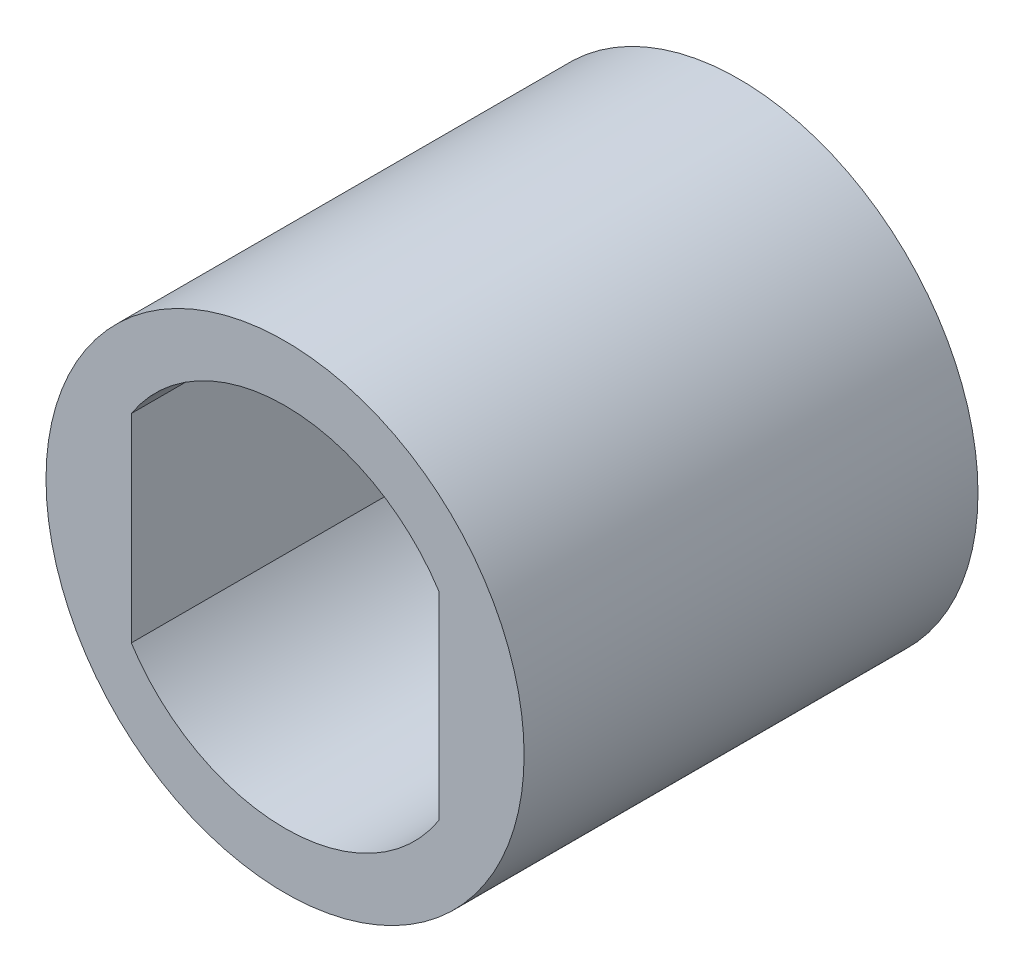
ISO-10303-21;
HEADER;
FILE_DESCRIPTION(('STEP AP214'),'2;1');
FILE_NAME('part.step','',(''),(''),'','','');
FILE_SCHEMA(('AUTOMOTIVE_DESIGN { 1 0 10303 214 1 1 1 1 }'));
ENDSEC;
DATA;
#1=APPLICATION_CONTEXT('core data for automotive mechanical design processes');
#2=APPLICATION_PROTOCOL_DEFINITION('international standard','automotive_design',2000,#1);
#3=PRODUCT_CONTEXT('',#1,'mechanical');
#4=PRODUCT('Part','Part','',(#3));
#5=PRODUCT_RELATED_PRODUCT_CATEGORY('part','',(#4));
#6=PRODUCT_DEFINITION_FORMATION('','',#4);
#7=PRODUCT_DEFINITION_CONTEXT('part definition',#1,'design');
#8=PRODUCT_DEFINITION('design','',#6,#7);
#9=PRODUCT_DEFINITION_SHAPE('','',#8);
#10=(LENGTH_UNIT() NAMED_UNIT(*) SI_UNIT(.MILLI.,.METRE.));
#11=(NAMED_UNIT(*) PLANE_ANGLE_UNIT() SI_UNIT($,.RADIAN.));
#12=(NAMED_UNIT(*) SI_UNIT($,.STERADIAN.) SOLID_ANGLE_UNIT());
#13=UNCERTAINTY_MEASURE_WITH_UNIT(LENGTH_MEASURE(1.E-05),#10,'distance_accuracy_value','');
#14=(GEOMETRIC_REPRESENTATION_CONTEXT(3) GLOBAL_UNCERTAINTY_ASSIGNED_CONTEXT((#13)) GLOBAL_UNIT_ASSIGNED_CONTEXT((#10,
#11,#12)) REPRESENTATION_CONTEXT('',''));
#15=CARTESIAN_POINT('',(0.,0.,0.));
#16=DIRECTION('',(0.,0.,1.));
#17=DIRECTION('',(1.,0.,0.));
#18=AXIS2_PLACEMENT_3D('',#15,#16,#17);
#19=CARTESIAN_POINT('',(0.,0.,15.));
#20=DIRECTION('',(0.,0.,1.));
#21=DIRECTION('',(1.,0.,0.));
#22=AXIS2_PLACEMENT_3D('',#19,#20,#21);
#23=PLANE('',#22);
#24=CARTESIAN_POINT('',(0.,0.,15.));
#25=DIRECTION('',(0.,0.,1.));
#26=DIRECTION('',(1.,0.,0.));
#27=AXIS2_PLACEMENT_3D('',#24,#25,#26);
#28=CIRCLE('',#27,7.9);
#29=CARTESIAN_POINT('',(7.9,0.,15.));
#30=VERTEX_POINT('',#29);
#31=EDGE_CURVE('E11',#30,#30,#28,.T.);
#32=ORIENTED_EDGE('',*,*,#31,.T.);
#33=EDGE_LOOP('',(#32));
#34=FACE_BOUND('',#33,.T.);
#35=DIRECTION('',(0.,-1.,0.));
#36=VECTOR('',#35,1.);
#37=CARTESIAN_POINT('',(-5.082,3.28264771183263,15.));
#38=LINE('',#37,#36);
#39=CARTESIAN_POINT('',(-5.082,3.28264771183263,15.));
#40=VERTEX_POINT('',#39);
#41=CARTESIAN_POINT('',(-5.082,-3.28264771183263,15.));
#42=VERTEX_POINT('',#41);
#43=EDGE_CURVE('E83',#40,#42,#38,.T.);
#44=ORIENTED_EDGE('',*,*,#43,.F.);
#45=CARTESIAN_POINT('',(0.,0.,15.));
#46=DIRECTION('',(0.,0.,1.));
#47=DIRECTION('',(1.,0.,0.));
#48=AXIS2_PLACEMENT_3D('',#45,#46,#47);
#49=CIRCLE('',#48,6.05);
#50=CARTESIAN_POINT('',(5.082,3.28264771183263,15.));
#51=VERTEX_POINT('',#50);
#52=EDGE_CURVE('E75',#51,#40,#49,.T.);
#53=ORIENTED_EDGE('',*,*,#52,.F.);
#54=DIRECTION('',(0.,1.,0.));
#55=VECTOR('',#54,1.);
#56=CARTESIAN_POINT('',(5.082,3.28264771183263,15.));
#57=LINE('',#56,#55);
#58=CARTESIAN_POINT('',(5.082,-3.28264771183263,15.));
#59=VERTEX_POINT('',#58);
#60=EDGE_CURVE('E96',#59,#51,#57,.T.);
#61=ORIENTED_EDGE('',*,*,#60,.F.);
#62=CARTESIAN_POINT('',(0.,0.,15.));
#63=DIRECTION('',(0.,0.,1.));
#64=DIRECTION('',(1.,0.,0.));
#65=AXIS2_PLACEMENT_3D('',#62,#63,#64);
#66=CIRCLE('',#65,6.05);
#67=EDGE_CURVE('E94',#42,#59,#66,.T.);
#68=ORIENTED_EDGE('',*,*,#67,.F.);
#69=EDGE_LOOP('',(#44,#53,#61,#68));
#70=FACE_BOUND('',#69,.T.);
#71=ADVANCED_FACE('F34',(#34,#70),#23,.T.);
#72=CARTESIAN_POINT('',(0.,0.,0.));
#73=DIRECTION('',(0.,0.,1.));
#74=DIRECTION('',(1.,0.,0.));
#75=AXIS2_PLACEMENT_3D('',#72,#73,#74);
#76=PLANE('',#75);
#77=CARTESIAN_POINT('',(0.,0.,0.));
#78=DIRECTION('',(0.,0.,1.));
#79=DIRECTION('',(1.,0.,0.));
#80=AXIS2_PLACEMENT_3D('',#77,#78,#79);
#81=CIRCLE('',#80,7.9);
#82=CARTESIAN_POINT('',(7.9,0.,0.));
#83=VERTEX_POINT('',#82);
#84=EDGE_CURVE('E38',#83,#83,#81,.T.);
#85=ORIENTED_EDGE('',*,*,#84,.F.);
#86=EDGE_LOOP('',(#85));
#87=FACE_BOUND('',#86,.T.);
#88=CARTESIAN_POINT('',(0.,0.,0.));
#89=DIRECTION('',(0.,0.,1.));
#90=DIRECTION('',(1.,0.,0.));
#91=AXIS2_PLACEMENT_3D('',#88,#89,#90);
#92=CIRCLE('',#91,6.05);
#93=CARTESIAN_POINT('',(5.082,3.28264771183263,0.));
#94=VERTEX_POINT('',#93);
#95=CARTESIAN_POINT('',(-5.082,3.28264771183263,0.));
#96=VERTEX_POINT('',#95);
#97=EDGE_CURVE('E57',#94,#96,#92,.T.);
#98=ORIENTED_EDGE('',*,*,#97,.T.);
#99=DIRECTION('',(0.,-1.,0.));
#100=VECTOR('',#99,1.);
#101=CARTESIAN_POINT('',(-5.082,3.28264771183263,0.));
#102=LINE('',#101,#100);
#103=CARTESIAN_POINT('',(-5.082,-3.28264771183263,0.));
#104=VERTEX_POINT('',#103);
#105=EDGE_CURVE('E90',#96,#104,#102,.T.);
#106=ORIENTED_EDGE('',*,*,#105,.T.);
#107=CARTESIAN_POINT('',(0.,0.,0.));
#108=DIRECTION('',(0.,0.,1.));
#109=DIRECTION('',(1.,0.,0.));
#110=AXIS2_PLACEMENT_3D('',#107,#108,#109);
#111=CIRCLE('',#110,6.05);
#112=CARTESIAN_POINT('',(5.082,-3.28264771183263,0.));
#113=VERTEX_POINT('',#112);
#114=EDGE_CURVE('E102',#104,#113,#111,.T.);
#115=ORIENTED_EDGE('',*,*,#114,.T.);
#116=DIRECTION('',(0.,1.,0.));
#117=VECTOR('',#116,1.);
#118=CARTESIAN_POINT('',(5.082,3.28264771183263,0.));
#119=LINE('',#118,#117);
#120=EDGE_CURVE('E84',#113,#94,#119,.T.);
#121=ORIENTED_EDGE('',*,*,#120,.T.);
#122=EDGE_LOOP('',(#98,#106,#115,#121));
#123=FACE_BOUND('',#122,.T.);
#124=ADVANCED_FACE('F113',(#87,#123),#76,.F.);
#125=CARTESIAN_POINT('',(0.,0.,15.));
#126=DIRECTION('',(0.,0.,-1.));
#127=DIRECTION('',(-1.,0.,0.));
#128=AXIS2_PLACEMENT_3D('',#125,#126,#127);
#129=CYLINDRICAL_SURFACE('',#128,7.9);
#130=ORIENTED_EDGE('',*,*,#31,.F.);
#131=EDGE_LOOP('',(#130));
#132=FACE_BOUND('',#131,.T.);
#133=ORIENTED_EDGE('',*,*,#84,.T.);
#134=EDGE_LOOP('',(#133));
#135=FACE_BOUND('',#134,.T.);
#136=ADVANCED_FACE('F36',(#132,#135),#129,.T.);
#137=CARTESIAN_POINT('',(0.,0.,15.));
#138=DIRECTION('',(0.,0.,-1.));
#139=DIRECTION('',(-1.,0.,0.));
#140=AXIS2_PLACEMENT_3D('',#137,#138,#139);
#141=CYLINDRICAL_SURFACE('',#140,6.05);
#142=ORIENTED_EDGE('',*,*,#97,.F.);
#143=DIRECTION('',(0.,0.,-1.));
#144=VECTOR('',#143,1.);
#145=CARTESIAN_POINT('',(5.082,3.28264771183263,15.));
#146=LINE('',#145,#144);
#147=EDGE_CURVE('E79',#51,#94,#146,.T.);
#148=ORIENTED_EDGE('',*,*,#147,.F.);
#149=ORIENTED_EDGE('',*,*,#52,.T.);
#150=DIRECTION('',(0.,0.,-1.));
#151=VECTOR('',#150,1.);
#152=CARTESIAN_POINT('',(-5.082,3.28264771183263,15.));
#153=LINE('',#152,#151);
#154=EDGE_CURVE('E78',#40,#96,#153,.T.);
#155=ORIENTED_EDGE('',*,*,#154,.T.);
#156=EDGE_LOOP('',(#142,#148,#149,#155));
#157=FACE_BOUND('',#156,.T.);
#158=ADVANCED_FACE('F77',(#157),#141,.F.);
#159=CARTESIAN_POINT('',(-5.082,3.28264771183263,15.));
#160=DIRECTION('',(1.,0.,0.));
#161=DIRECTION('',(0.,0.,-1.));
#162=AXIS2_PLACEMENT_3D('',#159,#160,#161);
#163=PLANE('',#162);
#164=ORIENTED_EDGE('',*,*,#105,.F.);
#165=ORIENTED_EDGE('',*,*,#154,.F.);
#166=ORIENTED_EDGE('',*,*,#43,.T.);
#167=DIRECTION('',(0.,0.,-1.));
#168=VECTOR('',#167,1.);
#169=CARTESIAN_POINT('',(-5.082,-3.28264771183263,15.));
#170=LINE('',#169,#168);
#171=EDGE_CURVE('E91',#42,#104,#170,.T.);
#172=ORIENTED_EDGE('',*,*,#171,.T.);
#173=EDGE_LOOP('',(#164,#165,#166,#172));
#174=FACE_BOUND('',#173,.T.);
#175=ADVANCED_FACE('F87',(#174),#163,.T.);
#176=CARTESIAN_POINT('',(0.,0.,15.));
#177=DIRECTION('',(0.,0.,-1.));
#178=DIRECTION('',(-1.,0.,0.));
#179=AXIS2_PLACEMENT_3D('',#176,#177,#178);
#180=CYLINDRICAL_SURFACE('',#179,6.05);
#181=ORIENTED_EDGE('',*,*,#114,.F.);
#182=ORIENTED_EDGE('',*,*,#171,.F.);
#183=ORIENTED_EDGE('',*,*,#67,.T.);
#184=DIRECTION('',(0.,0.,-1.));
#185=VECTOR('',#184,1.);
#186=CARTESIAN_POINT('',(5.082,-3.28264771183263,15.));
#187=LINE('',#186,#185);
#188=EDGE_CURVE('E49',#59,#113,#187,.T.);
#189=ORIENTED_EDGE('',*,*,#188,.T.);
#190=EDGE_LOOP('',(#181,#182,#183,#189));
#191=FACE_BOUND('',#190,.T.);
#192=ADVANCED_FACE('F111',(#191),#180,.F.);
#193=CARTESIAN_POINT('',(5.082,3.28264771183263,15.));
#194=DIRECTION('',(-1.,0.,0.));
#195=DIRECTION('',(0.,0.,1.));
#196=AXIS2_PLACEMENT_3D('',#193,#194,#195);
#197=PLANE('',#196);
#198=ORIENTED_EDGE('',*,*,#120,.F.);
#199=ORIENTED_EDGE('',*,*,#188,.F.);
#200=ORIENTED_EDGE('',*,*,#60,.T.);
#201=ORIENTED_EDGE('',*,*,#147,.T.);
#202=EDGE_LOOP('',(#198,#199,#200,#201));
#203=FACE_BOUND('',#202,.T.);
#204=ADVANCED_FACE('F114',(#203),#197,.T.);
#205=CLOSED_SHELL('',(#71,#124,#136,#158,#175,#192,#204));
#206=MANIFOLD_SOLID_BREP('B2',#205);
#207=ADVANCED_BREP_SHAPE_REPRESENTATION('',(#18,#206),#14);
#208=SHAPE_DEFINITION_REPRESENTATION(#9,#207);
ENDSEC;
END-ISO-10303-21;
